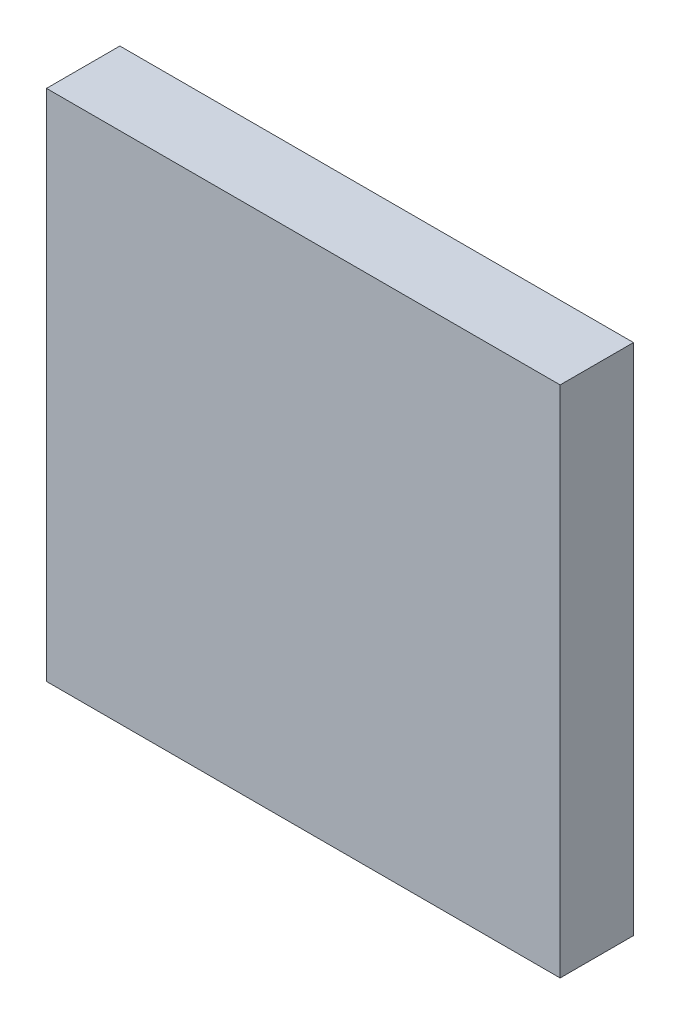
ISO-10303-21;
HEADER;
FILE_DESCRIPTION(('STEP AP214'),'2;1');
FILE_NAME('part.step','',(''),(''),'','','');
FILE_SCHEMA(('AUTOMOTIVE_DESIGN { 1 0 10303 214 1 1 1 1 }'));
ENDSEC;
DATA;
#1=APPLICATION_CONTEXT('core data for automotive mechanical design processes');
#2=APPLICATION_PROTOCOL_DEFINITION('international standard','automotive_design',2000,#1);
#3=PRODUCT_CONTEXT('',#1,'mechanical');
#4=PRODUCT('Part','Part','',(#3));
#5=PRODUCT_RELATED_PRODUCT_CATEGORY('part','',(#4));
#6=PRODUCT_DEFINITION_FORMATION('','',#4);
#7=PRODUCT_DEFINITION_CONTEXT('part definition',#1,'design');
#8=PRODUCT_DEFINITION('design','',#6,#7);
#9=PRODUCT_DEFINITION_SHAPE('','',#8);
#10=(LENGTH_UNIT() NAMED_UNIT(*) SI_UNIT(.MILLI.,.METRE.));
#11=(NAMED_UNIT(*) PLANE_ANGLE_UNIT() SI_UNIT($,.RADIAN.));
#12=(NAMED_UNIT(*) SI_UNIT($,.STERADIAN.) SOLID_ANGLE_UNIT());
#13=UNCERTAINTY_MEASURE_WITH_UNIT(LENGTH_MEASURE(1.E-05),#10,'distance_accuracy_value','');
#14=(GEOMETRIC_REPRESENTATION_CONTEXT(3) GLOBAL_UNCERTAINTY_ASSIGNED_CONTEXT((#13)) GLOBAL_UNIT_ASSIGNED_CONTEXT((#10,
#11,#12)) REPRESENTATION_CONTEXT('',''));
#15=CARTESIAN_POINT('',(0.,0.,0.));
#16=DIRECTION('',(0.,0.,1.));
#17=DIRECTION('',(1.,0.,0.));
#18=AXIS2_PLACEMENT_3D('',#15,#16,#17);
#19=CARTESIAN_POINT('',(-19.6137920493821,16.2132607614574,5.));
#20=DIRECTION('',(1.,0.,0.));
#21=DIRECTION('',(0.,1.,0.));
#22=AXIS2_PLACEMENT_3D('',#19,#20,#21);
#23=PLANE('',#22);
#24=DIRECTION('',(0.,-1.,0.));
#25=VECTOR('',#24,1.);
#26=CARTESIAN_POINT('',(-19.6137920493821,16.2132607614574,0.));
#27=LINE('',#26,#25);
#28=CARTESIAN_POINT('',(-19.6137920493821,16.2132607614574,0.));
#29=VERTEX_POINT('',#28);
#30=CARTESIAN_POINT('',(-19.6137920493821,-18.7867392385426,0.));
#31=VERTEX_POINT('',#30);
#32=EDGE_CURVE('E98',#29,#31,#27,.T.);
#33=ORIENTED_EDGE('',*,*,#32,.T.);
#34=DIRECTION('',(0.,0.,-1.));
#35=VECTOR('',#34,1.);
#36=CARTESIAN_POINT('',(-19.6137920493821,-18.7867392385426,5.));
#37=LINE('',#36,#35);
#38=CARTESIAN_POINT('',(-19.6137920493821,-18.7867392385426,5.));
#39=VERTEX_POINT('',#38);
#40=EDGE_CURVE('E11',#39,#31,#37,.T.);
#41=ORIENTED_EDGE('',*,*,#40,.F.);
#42=DIRECTION('',(0.,-1.,0.));
#43=VECTOR('',#42,1.);
#44=CARTESIAN_POINT('',(-19.6137920493821,16.2132607614574,5.));
#45=LINE('',#44,#43);
#46=CARTESIAN_POINT('',(-19.6137920493821,16.2132607614574,5.));
#47=VERTEX_POINT('',#46);
#48=EDGE_CURVE('E86',#47,#39,#45,.T.);
#49=ORIENTED_EDGE('',*,*,#48,.F.);
#50=DIRECTION('',(0.,0.,-1.));
#51=VECTOR('',#50,1.);
#52=CARTESIAN_POINT('',(-19.6137920493821,16.2132607614574,5.));
#53=LINE('',#52,#51);
#54=EDGE_CURVE('E94',#47,#29,#53,.T.);
#55=ORIENTED_EDGE('',*,*,#54,.T.);
#56=EDGE_LOOP('',(#33,#41,#49,#55));
#57=FACE_BOUND('',#56,.T.);
#58=ADVANCED_FACE('F35',(#57),#23,.F.);
#59=CARTESIAN_POINT('',(-19.6137920493821,-18.7867392385426,5.));
#60=DIRECTION('',(0.,1.,0.));
#61=DIRECTION('',(0.,0.,1.));
#62=AXIS2_PLACEMENT_3D('',#59,#60,#61);
#63=PLANE('',#62);
#64=DIRECTION('',(1.,0.,0.));
#65=VECTOR('',#64,1.);
#66=CARTESIAN_POINT('',(-19.6137920493821,-18.7867392385426,0.));
#67=LINE('',#66,#65);
#68=CARTESIAN_POINT('',(15.3862079506179,-18.7867392385426,0.));
#69=VERTEX_POINT('',#68);
#70=EDGE_CURVE('E90',#31,#69,#67,.T.);
#71=ORIENTED_EDGE('',*,*,#70,.T.);
#72=DIRECTION('',(0.,0.,-1.));
#73=VECTOR('',#72,1.);
#74=CARTESIAN_POINT('',(15.3862079506179,-18.7867392385426,5.));
#75=LINE('',#74,#73);
#76=CARTESIAN_POINT('',(15.3862079506179,-18.7867392385426,5.));
#77=VERTEX_POINT('',#76);
#78=EDGE_CURVE('E43',#77,#69,#75,.T.);
#79=ORIENTED_EDGE('',*,*,#78,.F.);
#80=DIRECTION('',(1.,0.,0.));
#81=VECTOR('',#80,1.);
#82=CARTESIAN_POINT('',(-19.6137920493821,-18.7867392385426,5.));
#83=LINE('',#82,#81);
#84=EDGE_CURVE('E81',#39,#77,#83,.T.);
#85=ORIENTED_EDGE('',*,*,#84,.F.);
#86=ORIENTED_EDGE('',*,*,#40,.T.);
#87=EDGE_LOOP('',(#71,#79,#85,#86));
#88=FACE_BOUND('',#87,.T.);
#89=ADVANCED_FACE('F89',(#88),#63,.F.);
#90=CARTESIAN_POINT('',(15.3862079506179,16.2132607614574,5.));
#91=DIRECTION('',(-1.,0.,0.));
#92=DIRECTION('',(0.,-1.,0.));
#93=AXIS2_PLACEMENT_3D('',#90,#91,#92);
#94=PLANE('',#93);
#95=DIRECTION('',(0.,1.,0.));
#96=VECTOR('',#95,1.);
#97=CARTESIAN_POINT('',(15.3862079506179,16.2132607614574,0.));
#98=LINE('',#97,#96);
#99=CARTESIAN_POINT('',(15.3862079506179,16.2132607614574,0.));
#100=VERTEX_POINT('',#99);
#101=EDGE_CURVE('E68',#69,#100,#98,.T.);
#102=ORIENTED_EDGE('',*,*,#101,.T.);
#103=DIRECTION('',(0.,0.,-1.));
#104=VECTOR('',#103,1.);
#105=CARTESIAN_POINT('',(15.3862079506179,16.2132607614574,5.));
#106=LINE('',#105,#104);
#107=CARTESIAN_POINT('',(15.3862079506179,16.2132607614574,5.));
#108=VERTEX_POINT('',#107);
#109=EDGE_CURVE('E91',#108,#100,#106,.T.);
#110=ORIENTED_EDGE('',*,*,#109,.F.);
#111=DIRECTION('',(0.,1.,0.));
#112=VECTOR('',#111,1.);
#113=CARTESIAN_POINT('',(15.3862079506179,16.2132607614574,5.));
#114=LINE('',#113,#112);
#115=EDGE_CURVE('E84',#77,#108,#114,.T.);
#116=ORIENTED_EDGE('',*,*,#115,.F.);
#117=ORIENTED_EDGE('',*,*,#78,.T.);
#118=EDGE_LOOP('',(#102,#110,#116,#117));
#119=FACE_BOUND('',#118,.T.);
#120=ADVANCED_FACE('F92',(#119),#94,.F.);
#121=CARTESIAN_POINT('',(-19.6137920493821,16.2132607614574,5.));
#122=DIRECTION('',(0.,-1.,0.));
#123=DIRECTION('',(0.,0.,-1.));
#124=AXIS2_PLACEMENT_3D('',#121,#122,#123);
#125=PLANE('',#124);
#126=DIRECTION('',(-1.,0.,0.));
#127=VECTOR('',#126,1.);
#128=CARTESIAN_POINT('',(-19.6137920493821,16.2132607614574,0.));
#129=LINE('',#128,#127);
#130=EDGE_CURVE('E74',#100,#29,#129,.T.);
#131=ORIENTED_EDGE('',*,*,#130,.T.);
#132=ORIENTED_EDGE('',*,*,#54,.F.);
#133=DIRECTION('',(-1.,0.,0.));
#134=VECTOR('',#133,1.);
#135=CARTESIAN_POINT('',(-19.6137920493821,16.2132607614574,5.));
#136=LINE('',#135,#134);
#137=EDGE_CURVE('E51',#108,#47,#136,.T.);
#138=ORIENTED_EDGE('',*,*,#137,.F.);
#139=ORIENTED_EDGE('',*,*,#109,.T.);
#140=EDGE_LOOP('',(#131,#132,#138,#139));
#141=FACE_BOUND('',#140,.T.);
#142=ADVANCED_FACE('F105',(#141),#125,.F.);
#143=CARTESIAN_POINT('',(0.,0.,5.));
#144=DIRECTION('',(0.,0.,1.));
#145=DIRECTION('',(1.,0.,0.));
#146=AXIS2_PLACEMENT_3D('',#143,#144,#145);
#147=PLANE('',#146);
#148=ORIENTED_EDGE('',*,*,#48,.T.);
#149=ORIENTED_EDGE('',*,*,#84,.T.);
#150=ORIENTED_EDGE('',*,*,#115,.T.);
#151=ORIENTED_EDGE('',*,*,#137,.T.);
#152=EDGE_LOOP('',(#148,#149,#150,#151));
#153=FACE_BOUND('',#152,.T.);
#154=ADVANCED_FACE('F82',(#153),#147,.T.);
#155=CARTESIAN_POINT('',(0.,0.,0.));
#156=DIRECTION('',(0.,0.,1.));
#157=DIRECTION('',(1.,0.,0.));
#158=AXIS2_PLACEMENT_3D('',#155,#156,#157);
#159=PLANE('',#158);
#160=ORIENTED_EDGE('',*,*,#32,.F.);
#161=ORIENTED_EDGE('',*,*,#130,.F.);
#162=ORIENTED_EDGE('',*,*,#101,.F.);
#163=ORIENTED_EDGE('',*,*,#70,.F.);
#164=EDGE_LOOP('',(#160,#161,#162,#163));
#165=FACE_BOUND('',#164,.T.);
#166=ADVANCED_FACE('F108',(#165),#159,.F.);
#167=CLOSED_SHELL('',(#58,#89,#120,#142,#154,#166));
#168=MANIFOLD_SOLID_BREP('B2',#167);
#169=ADVANCED_BREP_SHAPE_REPRESENTATION('',(#18,#168),#14);
#170=SHAPE_DEFINITION_REPRESENTATION(#9,#169);
ENDSEC;
END-ISO-10303-21;
